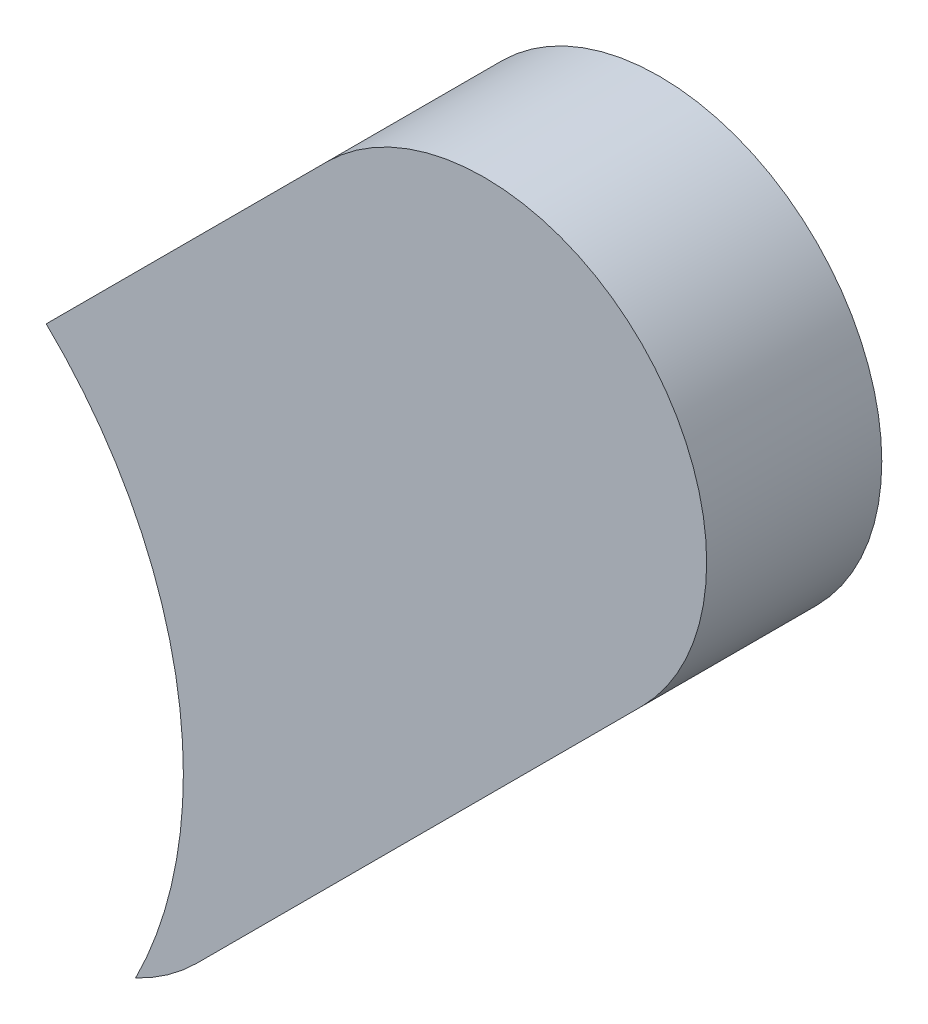
ISO-10303-21;
HEADER;
FILE_DESCRIPTION(('STEP AP214'),'2;1');
FILE_NAME('part.step','',(''),(''),'','','');
FILE_SCHEMA(('AUTOMOTIVE_DESIGN { 1 0 10303 214 1 1 1 1 }'));
ENDSEC;
DATA;
#1=APPLICATION_CONTEXT('core data for automotive mechanical design processes');
#2=APPLICATION_PROTOCOL_DEFINITION('international standard','automotive_design',2000,#1);
#3=PRODUCT_CONTEXT('',#1,'mechanical');
#4=PRODUCT('Part','Part','',(#3));
#5=PRODUCT_RELATED_PRODUCT_CATEGORY('part','',(#4));
#6=PRODUCT_DEFINITION_FORMATION('','',#4);
#7=PRODUCT_DEFINITION_CONTEXT('part definition',#1,'design');
#8=PRODUCT_DEFINITION('design','',#6,#7);
#9=PRODUCT_DEFINITION_SHAPE('','',#8);
#10=(LENGTH_UNIT() NAMED_UNIT(*) SI_UNIT(.MILLI.,.METRE.));
#11=(NAMED_UNIT(*) PLANE_ANGLE_UNIT() SI_UNIT($,.RADIAN.));
#12=(NAMED_UNIT(*) SI_UNIT($,.STERADIAN.) SOLID_ANGLE_UNIT());
#13=UNCERTAINTY_MEASURE_WITH_UNIT(LENGTH_MEASURE(1.E-05),#10,'distance_accuracy_value','');
#14=(GEOMETRIC_REPRESENTATION_CONTEXT(3) GLOBAL_UNCERTAINTY_ASSIGNED_CONTEXT((#13)) GLOBAL_UNIT_ASSIGNED_CONTEXT((#10,
#11,#12)) REPRESENTATION_CONTEXT('',''));
#15=CARTESIAN_POINT('',(0.,0.,0.));
#16=DIRECTION('',(0.,0.,1.));
#17=DIRECTION('',(1.,0.,0.));
#18=AXIS2_PLACEMENT_3D('',#15,#16,#17);
#19=CARTESIAN_POINT('',(90.6932654,110.1833966,0.));
#20=DIRECTION('',(-0.707106781186538,0.707106781186558,0.));
#21=DIRECTION('',(0.707106781186558,0.707106781186538,0.));
#22=AXIS2_PLACEMENT_3D('',#19,#20,#21);
#23=PLANE('',#22);
#24=DIRECTION('',(0.707106781186557,0.707106781186538,0.));
#25=VECTOR('',#24,1.);
#26=CARTESIAN_POINT('',(90.6932654,110.1833966,0.1999996));
#27=LINE('',#26,#25);
#28=CARTESIAN_POINT('',(90.6932654,110.1833966,0.1999996));
#29=VERTEX_POINT('',#28);
#30=CARTESIAN_POINT('',(91.20126286,110.69139406,0.1999996));
#31=VERTEX_POINT('',#30);
#32=EDGE_CURVE('E11',#29,#31,#27,.T.);
#33=ORIENTED_EDGE('',*,*,#32,.F.);
#34=DIRECTION('',(0.,0.,1.));
#35=VECTOR('',#34,1.);
#36=CARTESIAN_POINT('',(90.6932654,110.1833966,0.));
#37=LINE('',#36,#35);
#38=CARTESIAN_POINT('',(90.6932654,110.1833966,0.));
#39=VERTEX_POINT('',#38);
#40=EDGE_CURVE('E24',#39,#29,#37,.T.);
#41=ORIENTED_EDGE('',*,*,#40,.F.);
#42=DIRECTION('',(0.707106781186557,0.707106781186538,0.));
#43=VECTOR('',#42,1.);
#44=CARTESIAN_POINT('',(90.6932654,110.1833966,0.));
#45=LINE('',#44,#43);
#46=CARTESIAN_POINT('',(91.20126286,110.69139406,0.));
#47=VERTEX_POINT('',#46);
#48=EDGE_CURVE('E89',#39,#47,#45,.T.);
#49=ORIENTED_EDGE('',*,*,#48,.T.);
#50=DIRECTION('',(0.,0.,1.));
#51=VECTOR('',#50,1.);
#52=CARTESIAN_POINT('',(91.20126286,110.69139406,0.));
#53=LINE('',#52,#51);
#54=EDGE_CURVE('E37',#47,#31,#53,.T.);
#55=ORIENTED_EDGE('',*,*,#54,.T.);
#56=EDGE_LOOP('',(#33,#41,#49,#55));
#57=FACE_BOUND('',#56,.T.);
#58=ADVANCED_FACE('F17',(#57),#23,.F.);
#59=CARTESIAN_POINT('',(91.02165819,110.87099873,0.));
#60=DIRECTION('',(0.,0.,-1.));
#61=DIRECTION('',(0.70710678118652,-0.707106781186576,0.));
#62=AXIS2_PLACEMENT_3D('',#59,#60,#61);
#63=CYLINDRICAL_SURFACE('',#62,0.253999360179552);
#64=CARTESIAN_POINT('',(91.02165819,110.87099873,0.1999996));
#65=DIRECTION('',(0.,0.,1.));
#66=DIRECTION('',(0.70710678118652,-0.707106781186576,0.));
#67=AXIS2_PLACEMENT_3D('',#64,#65,#66);
#68=CIRCLE('',#67,0.253999360179552);
#69=CARTESIAN_POINT('',(90.84205352,111.0506034,0.1999996));
#70=VERTEX_POINT('',#69);
#71=EDGE_CURVE('E111',#31,#70,#68,.T.);
#72=ORIENTED_EDGE('',*,*,#71,.F.);
#73=ORIENTED_EDGE('',*,*,#54,.F.);
#74=CARTESIAN_POINT('',(91.02165819,110.87099873,0.));
#75=DIRECTION('',(0.,0.,1.));
#76=DIRECTION('',(0.70710678118652,-0.707106781186576,0.));
#77=AXIS2_PLACEMENT_3D('',#74,#75,#76);
#78=CIRCLE('',#77,0.253999360179552);
#79=CARTESIAN_POINT('',(90.84205352,111.0506034,0.));
#80=VERTEX_POINT('',#79);
#81=EDGE_CURVE('E108',#47,#80,#78,.T.);
#82=ORIENTED_EDGE('',*,*,#81,.T.);
#83=DIRECTION('',(0.,0.,1.));
#84=VECTOR('',#83,1.);
#85=CARTESIAN_POINT('',(90.84205352,111.0506034,0.));
#86=LINE('',#85,#84);
#87=EDGE_CURVE('E106',#80,#70,#86,.T.);
#88=ORIENTED_EDGE('',*,*,#87,.T.);
#89=EDGE_LOOP('',(#72,#73,#82,#88));
#90=FACE_BOUND('',#89,.T.);
#91=ADVANCED_FACE('F118',(#90),#63,.T.);
#92=CARTESIAN_POINT('',(90.84205352,111.0506034,0.));
#93=DIRECTION('',(0.707106781186558,-0.707106781186538,0.));
#94=DIRECTION('',(-0.707106781186538,-0.707106781186558,0.));
#95=AXIS2_PLACEMENT_3D('',#92,#93,#94);
#96=PLANE('',#95);
#97=DIRECTION('',(-0.707106781186538,-0.707106781186557,0.));
#98=VECTOR('',#97,1.);
#99=CARTESIAN_POINT('',(90.84205352,111.0506034,0.1999996));
#100=LINE('',#99,#98);
#101=CARTESIAN_POINT('',(90.5213511524912,110.729901032491,0.1999996));
#102=VERTEX_POINT('',#101);
#103=EDGE_CURVE('E103',#70,#102,#100,.T.);
#104=ORIENTED_EDGE('',*,*,#103,.F.);
#105=ORIENTED_EDGE('',*,*,#87,.F.);
#106=DIRECTION('',(-0.707106781186538,-0.707106781186557,0.));
#107=VECTOR('',#106,1.);
#108=CARTESIAN_POINT('',(90.84205352,111.0506034,0.));
#109=LINE('',#108,#107);
#110=CARTESIAN_POINT('',(90.5213511524912,110.729901032491,0.));
#111=VERTEX_POINT('',#110);
#112=EDGE_CURVE('E100',#80,#111,#109,.T.);
#113=ORIENTED_EDGE('',*,*,#112,.T.);
#114=DIRECTION('',(0.,0.,1.));
#115=VECTOR('',#114,1.);
#116=CARTESIAN_POINT('',(90.5213511524912,110.729901032491,0.));
#117=LINE('',#116,#115);
#118=EDGE_CURVE('E98',#111,#102,#117,.T.);
#119=ORIENTED_EDGE('',*,*,#118,.T.);
#120=EDGE_LOOP('',(#104,#105,#113,#119));
#121=FACE_BOUND('',#120,.T.);
#122=ADVANCED_FACE('F124',(#121),#96,.F.);
#123=CARTESIAN_POINT('',(90.17,110.363,0.));
#124=DIRECTION('',(0.,0.,-1.));
#125=DIRECTION('',(1.,0.,0.));
#126=AXIS2_PLACEMENT_3D('',#123,#124,#125);
#127=CYLINDRICAL_SURFACE('',#126,0.508);
#128=DIRECTION('',(0.,0.,1.));
#129=VECTOR('',#128,1.);
#130=CARTESIAN_POINT('',(90.678,110.363,0.));
#131=LINE('',#130,#129);
#132=CARTESIAN_POINT('',(90.678,110.363,0.));
#133=VERTEX_POINT('',#132);
#134=CARTESIAN_POINT('',(90.678,110.363,0.1999996));
#135=VERTEX_POINT('',#134);
#136=EDGE_CURVE('E81',#133,#135,#131,.T.);
#137=ORIENTED_EDGE('',*,*,#136,.T.);
#138=CARTESIAN_POINT('',(90.17,110.363,0.1999996));
#139=DIRECTION('',(0.,0.,1.));
#140=DIRECTION('',(1.,0.,0.));
#141=AXIS2_PLACEMENT_3D('',#138,#139,#140);
#142=CIRCLE('',#141,0.508);
#143=EDGE_CURVE('E94',#135,#102,#142,.T.);
#144=ORIENTED_EDGE('',*,*,#143,.T.);
#145=ORIENTED_EDGE('',*,*,#118,.F.);
#146=CARTESIAN_POINT('',(90.17,110.363,0.));
#147=DIRECTION('',(0.,0.,1.));
#148=DIRECTION('',(1.,0.,0.));
#149=AXIS2_PLACEMENT_3D('',#146,#147,#148);
#150=CIRCLE('',#149,0.508);
#151=EDGE_CURVE('E75',#133,#111,#150,.T.);
#152=ORIENTED_EDGE('',*,*,#151,.F.);
#153=EDGE_LOOP('',(#137,#144,#145,#152));
#154=FACE_BOUND('',#153,.T.);
#155=ADVANCED_FACE('F126',(#154),#127,.F.);
#156=CARTESIAN_POINT('',(90.17,110.363,0.));
#157=DIRECTION('',(0.,0.,-1.));
#158=DIRECTION('',(1.,0.,0.));
#159=AXIS2_PLACEMENT_3D('',#156,#157,#158);
#160=CYLINDRICAL_SURFACE('',#159,0.508);
#161=DIRECTION('',(0.,0.,1.));
#162=VECTOR('',#161,1.);
#163=CARTESIAN_POINT('',(90.6234291773352,110.133945462518,0.));
#164=LINE('',#163,#162);
#165=CARTESIAN_POINT('',(90.6234291773352,110.133945462518,0.));
#166=VERTEX_POINT('',#165);
#167=CARTESIAN_POINT('',(90.6234291773352,110.133945462518,0.1999996));
#168=VERTEX_POINT('',#167);
#169=EDGE_CURVE('E65',#166,#168,#164,.T.);
#170=ORIENTED_EDGE('',*,*,#169,.T.);
#171=CARTESIAN_POINT('',(90.17,110.363,0.1999996));
#172=DIRECTION('',(0.,0.,1.));
#173=DIRECTION('',(1.,0.,0.));
#174=AXIS2_PLACEMENT_3D('',#171,#172,#173);
#175=CIRCLE('',#174,0.508);
#176=EDGE_CURVE('E76',#168,#135,#175,.T.);
#177=ORIENTED_EDGE('',*,*,#176,.T.);
#178=ORIENTED_EDGE('',*,*,#136,.F.);
#179=EDGE_CURVE('E79',#166,#133,#150,.T.);
#180=ORIENTED_EDGE('',*,*,#179,.F.);
#181=EDGE_LOOP('',(#170,#177,#178,#180));
#182=FACE_BOUND('',#181,.T.);
#183=ADVANCED_FACE('F80',(#182),#160,.F.);
#184=CARTESIAN_POINT('',(90.51366073,110.36300127,0.));
#185=DIRECTION('',(0.,0.,-1.));
#186=DIRECTION('',(-0.707106781186548,0.707106781186548,0.));
#187=AXIS2_PLACEMENT_3D('',#184,#185,#186);
#188=CYLINDRICAL_SURFACE('',#187,0.253999360179542);
#189=CARTESIAN_POINT('',(90.51366073,110.36300127,0.1999996));
#190=DIRECTION('',(0.,0.,1.));
#191=DIRECTION('',(-0.707106781186548,0.707106781186548,0.));
#192=AXIS2_PLACEMENT_3D('',#189,#190,#191);
#193=CIRCLE('',#192,0.253999360179542);
#194=EDGE_CURVE('E71',#168,#29,#193,.T.);
#195=ORIENTED_EDGE('',*,*,#194,.F.);
#196=ORIENTED_EDGE('',*,*,#169,.F.);
#197=CARTESIAN_POINT('',(90.51366073,110.36300127,0.));
#198=DIRECTION('',(0.,0.,1.));
#199=DIRECTION('',(-0.707106781186548,0.707106781186548,0.));
#200=AXIS2_PLACEMENT_3D('',#197,#198,#199);
#201=CIRCLE('',#200,0.253999360179542);
#202=EDGE_CURVE('E69',#166,#39,#201,.T.);
#203=ORIENTED_EDGE('',*,*,#202,.T.);
#204=ORIENTED_EDGE('',*,*,#40,.T.);
#205=EDGE_LOOP('',(#195,#196,#203,#204));
#206=FACE_BOUND('',#205,.T.);
#207=ADVANCED_FACE('F67',(#206),#188,.T.);
#208=CARTESIAN_POINT('',(90.6932654,110.1833966,0.));
#209=DIRECTION('',(0.,0.,-1.));
#210=DIRECTION('',(-1.,0.,0.));
#211=AXIS2_PLACEMENT_3D('',#208,#209,#210);
#212=PLANE('',#211);
#213=ORIENTED_EDGE('',*,*,#48,.F.);
#214=ORIENTED_EDGE('',*,*,#202,.F.);
#215=ORIENTED_EDGE('',*,*,#179,.T.);
#216=ORIENTED_EDGE('',*,*,#151,.T.);
#217=ORIENTED_EDGE('',*,*,#112,.F.);
#218=ORIENTED_EDGE('',*,*,#81,.F.);
#219=EDGE_LOOP('',(#213,#214,#215,#216,#217,#218));
#220=FACE_BOUND('',#219,.T.);
#221=ADVANCED_FACE('F87',(#220),#212,.T.);
#222=CARTESIAN_POINT('',(90.6932654,110.1833966,0.1999996));
#223=DIRECTION('',(0.,0.,-1.));
#224=DIRECTION('',(-1.,0.,0.));
#225=AXIS2_PLACEMENT_3D('',#222,#223,#224);
#226=PLANE('',#225);
#227=ORIENTED_EDGE('',*,*,#194,.T.);
#228=ORIENTED_EDGE('',*,*,#32,.T.);
#229=ORIENTED_EDGE('',*,*,#71,.T.);
#230=ORIENTED_EDGE('',*,*,#103,.T.);
#231=ORIENTED_EDGE('',*,*,#143,.F.);
#232=ORIENTED_EDGE('',*,*,#176,.F.);
#233=EDGE_LOOP('',(#227,#228,#229,#230,#231,#232));
#234=FACE_BOUND('',#233,.T.);
#235=ADVANCED_FACE('F121',(#234),#226,.F.);
#236=CLOSED_SHELL('',(#58,#91,#122,#155,#183,#207,#221,#235));
#237=MANIFOLD_SOLID_BREP('B1',#236);
#238=ADVANCED_BREP_SHAPE_REPRESENTATION('',(#18,#237),#14);
#239=SHAPE_DEFINITION_REPRESENTATION(#9,#238);
ENDSEC;
END-ISO-10303-21;
